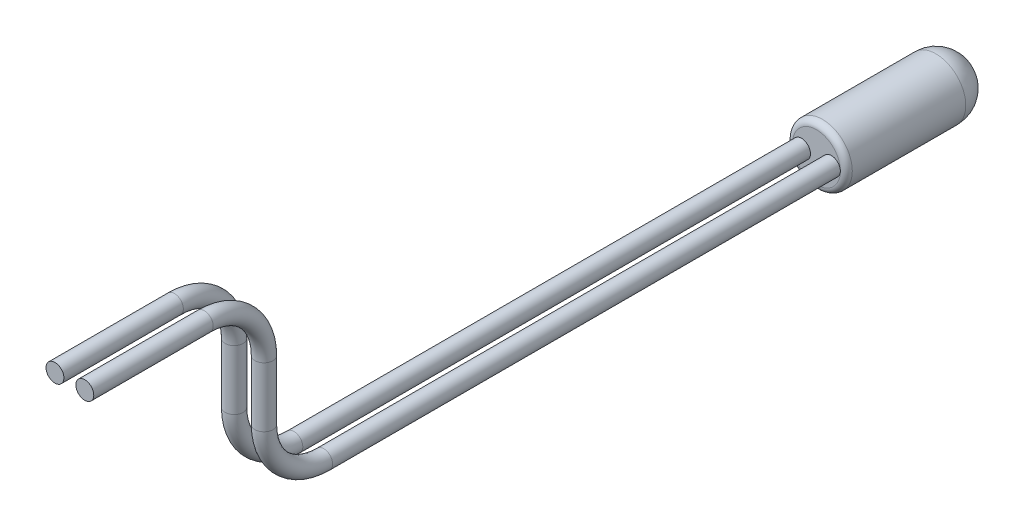
ISO-10303-21;
HEADER;
FILE_DESCRIPTION(('STEP AP214'),'2;1');
FILE_NAME('part.step','',(''),(''),'','','');
FILE_SCHEMA(('AUTOMOTIVE_DESIGN { 1 0 10303 214 1 1 1 1 }'));
ENDSEC;
DATA;
#1=APPLICATION_CONTEXT('core data for automotive mechanical design processes');
#2=APPLICATION_PROTOCOL_DEFINITION('international standard','automotive_design',2000,#1);
#3=PRODUCT_CONTEXT('',#1,'mechanical');
#4=PRODUCT('Part','Part','',(#3));
#5=PRODUCT_RELATED_PRODUCT_CATEGORY('part','',(#4));
#6=PRODUCT_DEFINITION_FORMATION('','',#4);
#7=PRODUCT_DEFINITION_CONTEXT('part definition',#1,'design');
#8=PRODUCT_DEFINITION('design','',#6,#7);
#9=PRODUCT_DEFINITION_SHAPE('','',#8);
#10=(LENGTH_UNIT() NAMED_UNIT(*) SI_UNIT(.MILLI.,.METRE.));
#11=(NAMED_UNIT(*) PLANE_ANGLE_UNIT() SI_UNIT($,.RADIAN.));
#12=(NAMED_UNIT(*) SI_UNIT($,.STERADIAN.) SOLID_ANGLE_UNIT());
#13=UNCERTAINTY_MEASURE_WITH_UNIT(LENGTH_MEASURE(1.E-05),#10,'distance_accuracy_value','');
#14=(GEOMETRIC_REPRESENTATION_CONTEXT(3) GLOBAL_UNCERTAINTY_ASSIGNED_CONTEXT((#13)) GLOBAL_UNIT_ASSIGNED_CONTEXT((#10,
#11,#12)) REPRESENTATION_CONTEXT('',''));
#15=CARTESIAN_POINT('',(0.,0.,0.));
#16=DIRECTION('',(0.,0.,1.));
#17=DIRECTION('',(1.,0.,0.));
#18=AXIS2_PLACEMENT_3D('',#15,#16,#17);
#19=CARTESIAN_POINT('',(0.25,0.,1.25));
#20=DIRECTION('',(0.,0.,1.));
#21=DIRECTION('',(1.,0.,0.));
#22=AXIS2_PLACEMENT_3D('',#19,#20,#21);
#23=PLANE('',#22);
#24=CARTESIAN_POINT('',(0.25,0.,1.25));
#25=DIRECTION('',(0.,0.,1.));
#26=DIRECTION('',(1.,0.,0.));
#27=AXIS2_PLACEMENT_3D('',#24,#25,#26);
#28=CIRCLE('',#27,0.15);
#29=CARTESIAN_POINT('',(0.4,0.,1.25));
#30=VERTEX_POINT('',#29);
#31=EDGE_CURVE('E71',#30,#30,#28,.T.);
#32=ORIENTED_EDGE('',*,*,#31,.F.);
#33=EDGE_LOOP('',(#32));
#34=FACE_BOUND('',#33,.T.);
#35=ADVANCED_FACE('F49',(#34),#23,.F.);
#36=CARTESIAN_POINT('',(0.25,3.,13.75));
#37=DIRECTION('',(0.,0.,1.));
#38=DIRECTION('',(1.,0.,0.));
#39=AXIS2_PLACEMENT_3D('',#36,#37,#38);
#40=PLANE('',#39);
#41=CARTESIAN_POINT('',(0.25,3.,13.75));
#42=DIRECTION('',(0.,0.,1.));
#43=DIRECTION('',(1.,0.,0.));
#44=AXIS2_PLACEMENT_3D('',#41,#42,#43);
#45=CIRCLE('',#44,0.15);
#46=CARTESIAN_POINT('',(0.4,3.,13.75));
#47=VERTEX_POINT('',#46);
#48=EDGE_CURVE('E11',#47,#47,#45,.T.);
#49=ORIENTED_EDGE('',*,*,#48,.T.);
#50=EDGE_LOOP('',(#49));
#51=FACE_BOUND('',#50,.T.);
#52=ADVANCED_FACE('F78',(#51),#40,.T.);
#53=CARTESIAN_POINT('',(0.25,0.,1.25));
#54=DIRECTION('',(0.,0.,1.));
#55=DIRECTION('',(0.,-1.,0.));
#56=AXIS2_PLACEMENT_3D('',#53,#54,#55);
#57=CYLINDRICAL_SURFACE('',#56,0.15);
#58=CARTESIAN_POINT('',(0.25,0.,9.75));
#59=DIRECTION('',(0.,0.,1.));
#60=DIRECTION('',(1.,0.,0.));
#61=AXIS2_PLACEMENT_3D('',#58,#59,#60);
#62=CIRCLE('',#61,0.15);
#63=CARTESIAN_POINT('',(0.25,-0.15,9.75));
#64=VERTEX_POINT('',#63);
#65=EDGE_CURVE('E68',#64,#64,#62,.T.);
#66=ORIENTED_EDGE('',*,*,#65,.F.);
#67=EDGE_LOOP('',(#66));
#68=FACE_BOUND('',#67,.T.);
#69=ORIENTED_EDGE('',*,*,#31,.T.);
#70=EDGE_LOOP('',(#69));
#71=FACE_BOUND('',#70,.T.);
#72=ADVANCED_FACE('F75',(#68,#71),#57,.T.);
#73=CARTESIAN_POINT('',(0.25,0.999999999999999,9.75));
#74=DIRECTION('',(-1.,0.,0.));
#75=DIRECTION('',(0.,0.,1.));
#76=AXIS2_PLACEMENT_3D('',#73,#74,#75);
#77=TOROIDAL_SURFACE('',#76,0.999999999999999,0.15);
#78=CARTESIAN_POINT('',(0.25,0.999999999999999,10.75));
#79=DIRECTION('',(0.,1.,0.));
#80=DIRECTION('',(1.,0.,0.));
#81=AXIS2_PLACEMENT_3D('',#78,#79,#80);
#82=CIRCLE('',#81,0.15);
#83=CARTESIAN_POINT('',(0.25,0.999999999999999,10.9));
#84=VERTEX_POINT('',#83);
#85=EDGE_CURVE('E63',#84,#84,#82,.T.);
#86=CARTESIAN_POINT('',(0.25,0.999999999999999,9.75));
#87=DIRECTION('',(-1.,0.,0.));
#88=DIRECTION('',(0.,0.,1.));
#89=AXIS2_PLACEMENT_3D('',#86,#87,#88);
#90=CIRCLE('',#89,1.15);
#91=EDGE_CURVE('',#64,#84,#90,.T.);
#92=ORIENTED_EDGE('',*,*,#65,.T.);
#93=ORIENTED_EDGE('',*,*,#85,.F.);
#94=ORIENTED_EDGE('',*,*,#91,.T.);
#95=ORIENTED_EDGE('',*,*,#91,.F.);
#96=EDGE_LOOP('',(#92,#94,#93,#95));
#97=FACE_BOUND('',#96,.T.);
#98=ADVANCED_FACE('F96',(#97),#77,.T.);
#99=CARTESIAN_POINT('',(0.25,0.999999999999999,10.75));
#100=DIRECTION('',(0.,1.,0.));
#101=DIRECTION('',(0.,0.,1.));
#102=AXIS2_PLACEMENT_3D('',#99,#100,#101);
#103=CYLINDRICAL_SURFACE('',#102,0.15);
#104=CARTESIAN_POINT('',(0.25,2.,10.75));
#105=DIRECTION('',(0.,1.,0.));
#106=DIRECTION('',(1.,0.,0.));
#107=AXIS2_PLACEMENT_3D('',#104,#105,#106);
#108=CIRCLE('',#107,0.15);
#109=CARTESIAN_POINT('',(0.25,2.,10.6));
#110=VERTEX_POINT('',#109);
#111=EDGE_CURVE('E59',#110,#110,#108,.T.);
#112=ORIENTED_EDGE('',*,*,#111,.F.);
#113=EDGE_LOOP('',(#112));
#114=FACE_BOUND('',#113,.T.);
#115=ORIENTED_EDGE('',*,*,#85,.T.);
#116=EDGE_LOOP('',(#115));
#117=FACE_BOUND('',#116,.T.);
#118=ADVANCED_FACE('F90',(#114,#117),#103,.T.);
#119=CARTESIAN_POINT('',(0.25,2.,11.75));
#120=DIRECTION('',(1.,0.,0.));
#121=DIRECTION('',(0.,0.,-1.));
#122=AXIS2_PLACEMENT_3D('',#119,#120,#121);
#123=TOROIDAL_SURFACE('',#122,0.999999999999999,0.15);
#124=CARTESIAN_POINT('',(0.25,3.,11.75));
#125=DIRECTION('',(0.,0.,1.));
#126=DIRECTION('',(1.,0.,0.));
#127=AXIS2_PLACEMENT_3D('',#124,#125,#126);
#128=CIRCLE('',#127,0.15);
#129=CARTESIAN_POINT('',(0.25,3.15,11.75));
#130=VERTEX_POINT('',#129);
#131=EDGE_CURVE('E55',#130,#130,#128,.T.);
#132=CARTESIAN_POINT('',(0.25,2.,11.75));
#133=DIRECTION('',(1.,0.,0.));
#134=DIRECTION('',(0.,0.,-1.));
#135=AXIS2_PLACEMENT_3D('',#132,#133,#134);
#136=CIRCLE('',#135,1.15);
#137=EDGE_CURVE('',#110,#130,#136,.T.);
#138=ORIENTED_EDGE('',*,*,#111,.T.);
#139=ORIENTED_EDGE('',*,*,#131,.F.);
#140=ORIENTED_EDGE('',*,*,#137,.T.);
#141=ORIENTED_EDGE('',*,*,#137,.F.);
#142=EDGE_LOOP('',(#138,#140,#139,#141));
#143=FACE_BOUND('',#142,.T.);
#144=ADVANCED_FACE('F84',(#143),#123,.T.);
#145=CARTESIAN_POINT('',(0.25,3.,11.75));
#146=DIRECTION('',(0.,0.,1.));
#147=DIRECTION('',(0.,-1.,0.));
#148=AXIS2_PLACEMENT_3D('',#145,#146,#147);
#149=CYLINDRICAL_SURFACE('',#148,0.15);
#150=ORIENTED_EDGE('',*,*,#48,.F.);
#151=EDGE_LOOP('',(#150));
#152=FACE_BOUND('',#151,.T.);
#153=ORIENTED_EDGE('',*,*,#131,.T.);
#154=EDGE_LOOP('',(#153));
#155=FACE_BOUND('',#154,.T.);
#156=ADVANCED_FACE('F82',(#152,#155),#149,.T.);
#157=CLOSED_SHELL('',(#35,#52,#72,#98,#118,#144,#156));
#158=MANIFOLD_SOLID_BREP('B2',#157);
#159=CARTESIAN_POINT('',(-0.25,0.,1.25));
#160=DIRECTION('',(0.,0.,1.));
#161=DIRECTION('',(1.,0.,0.));
#162=AXIS2_PLACEMENT_3D('',#159,#160,#161);
#163=PLANE('',#162);
#164=CARTESIAN_POINT('',(-0.25,0.,1.25));
#165=DIRECTION('',(0.,0.,1.));
#166=DIRECTION('',(1.,0.,0.));
#167=AXIS2_PLACEMENT_3D('',#164,#165,#166);
#168=CIRCLE('',#167,0.15);
#169=CARTESIAN_POINT('',(-0.0999999999999999,0.,1.25));
#170=VERTEX_POINT('',#169);
#171=EDGE_CURVE('E192',#170,#170,#168,.T.);
#172=ORIENTED_EDGE('',*,*,#171,.F.);
#173=EDGE_LOOP('',(#172));
#174=FACE_BOUND('',#173,.T.);
#175=ADVANCED_FACE('F170',(#174),#163,.F.);
#176=CARTESIAN_POINT('',(-0.25,3.,13.75));
#177=DIRECTION('',(0.,0.,1.));
#178=DIRECTION('',(1.,0.,0.));
#179=AXIS2_PLACEMENT_3D('',#176,#177,#178);
#180=PLANE('',#179);
#181=CARTESIAN_POINT('',(-0.25,3.,13.75));
#182=DIRECTION('',(0.,0.,1.));
#183=DIRECTION('',(1.,0.,0.));
#184=AXIS2_PLACEMENT_3D('',#181,#182,#183);
#185=CIRCLE('',#184,0.15);
#186=CARTESIAN_POINT('',(-0.0999999999999999,3.,13.75));
#187=VERTEX_POINT('',#186);
#188=EDGE_CURVE('E48',#187,#187,#185,.T.);
#189=ORIENTED_EDGE('',*,*,#188,.T.);
#190=EDGE_LOOP('',(#189));
#191=FACE_BOUND('',#190,.T.);
#192=ADVANCED_FACE('F199',(#191),#180,.T.);
#193=CARTESIAN_POINT('',(-0.25,0.,1.25));
#194=DIRECTION('',(0.,0.,1.));
#195=DIRECTION('',(0.,-1.,0.));
#196=AXIS2_PLACEMENT_3D('',#193,#194,#195);
#197=CYLINDRICAL_SURFACE('',#196,0.15);
#198=CARTESIAN_POINT('',(-0.25,0.,9.75));
#199=DIRECTION('',(0.,0.,1.));
#200=DIRECTION('',(1.,0.,0.));
#201=AXIS2_PLACEMENT_3D('',#198,#199,#200);
#202=CIRCLE('',#201,0.15);
#203=CARTESIAN_POINT('',(-0.25,-0.15,9.75));
#204=VERTEX_POINT('',#203);
#205=EDGE_CURVE('E189',#204,#204,#202,.T.);
#206=ORIENTED_EDGE('',*,*,#205,.F.);
#207=EDGE_LOOP('',(#206));
#208=FACE_BOUND('',#207,.T.);
#209=ORIENTED_EDGE('',*,*,#171,.T.);
#210=EDGE_LOOP('',(#209));
#211=FACE_BOUND('',#210,.T.);
#212=ADVANCED_FACE('F196',(#208,#211),#197,.T.);
#213=CARTESIAN_POINT('',(-0.25,0.999999999999999,9.75));
#214=DIRECTION('',(-1.,0.,0.));
#215=DIRECTION('',(0.,0.,1.));
#216=AXIS2_PLACEMENT_3D('',#213,#214,#215);
#217=TOROIDAL_SURFACE('',#216,0.999999999999999,0.15);
#218=CARTESIAN_POINT('',(-0.25,0.999999999999999,10.75));
#219=DIRECTION('',(0.,1.,0.));
#220=DIRECTION('',(1.,0.,0.));
#221=AXIS2_PLACEMENT_3D('',#218,#219,#220);
#222=CIRCLE('',#221,0.15);
#223=CARTESIAN_POINT('',(-0.25,0.999999999999999,10.9));
#224=VERTEX_POINT('',#223);
#225=EDGE_CURVE('E184',#224,#224,#222,.T.);
#226=CARTESIAN_POINT('',(-0.25,0.999999999999999,9.75));
#227=DIRECTION('',(-1.,0.,0.));
#228=DIRECTION('',(0.,0.,1.));
#229=AXIS2_PLACEMENT_3D('',#226,#227,#228);
#230=CIRCLE('',#229,1.15);
#231=EDGE_CURVE('',#204,#224,#230,.T.);
#232=ORIENTED_EDGE('',*,*,#205,.T.);
#233=ORIENTED_EDGE('',*,*,#225,.F.);
#234=ORIENTED_EDGE('',*,*,#231,.T.);
#235=ORIENTED_EDGE('',*,*,#231,.F.);
#236=EDGE_LOOP('',(#232,#234,#233,#235));
#237=FACE_BOUND('',#236,.T.);
#238=ADVANCED_FACE('F217',(#237),#217,.T.);
#239=CARTESIAN_POINT('',(-0.25,0.999999999999999,10.75));
#240=DIRECTION('',(0.,1.,0.));
#241=DIRECTION('',(0.,0.,1.));
#242=AXIS2_PLACEMENT_3D('',#239,#240,#241);
#243=CYLINDRICAL_SURFACE('',#242,0.15);
#244=CARTESIAN_POINT('',(-0.25,2.,10.75));
#245=DIRECTION('',(0.,1.,0.));
#246=DIRECTION('',(1.,0.,0.));
#247=AXIS2_PLACEMENT_3D('',#244,#245,#246);
#248=CIRCLE('',#247,0.15);
#249=CARTESIAN_POINT('',(-0.25,2.,10.6));
#250=VERTEX_POINT('',#249);
#251=EDGE_CURVE('E180',#250,#250,#248,.T.);
#252=ORIENTED_EDGE('',*,*,#251,.F.);
#253=EDGE_LOOP('',(#252));
#254=FACE_BOUND('',#253,.T.);
#255=ORIENTED_EDGE('',*,*,#225,.T.);
#256=EDGE_LOOP('',(#255));
#257=FACE_BOUND('',#256,.T.);
#258=ADVANCED_FACE('F211',(#254,#257),#243,.T.);
#259=CARTESIAN_POINT('',(-0.25,2.,11.75));
#260=DIRECTION('',(1.,0.,0.));
#261=DIRECTION('',(0.,0.,-1.));
#262=AXIS2_PLACEMENT_3D('',#259,#260,#261);
#263=TOROIDAL_SURFACE('',#262,0.999999999999999,0.15);
#264=CARTESIAN_POINT('',(-0.25,3.,11.75));
#265=DIRECTION('',(0.,0.,1.));
#266=DIRECTION('',(1.,0.,0.));
#267=AXIS2_PLACEMENT_3D('',#264,#265,#266);
#268=CIRCLE('',#267,0.15);
#269=CARTESIAN_POINT('',(-0.25,3.15,11.75));
#270=VERTEX_POINT('',#269);
#271=EDGE_CURVE('E176',#270,#270,#268,.T.);
#272=CARTESIAN_POINT('',(-0.25,2.,11.75));
#273=DIRECTION('',(1.,0.,0.));
#274=DIRECTION('',(0.,0.,-1.));
#275=AXIS2_PLACEMENT_3D('',#272,#273,#274);
#276=CIRCLE('',#275,1.15);
#277=EDGE_CURVE('',#250,#270,#276,.T.);
#278=ORIENTED_EDGE('',*,*,#251,.T.);
#279=ORIENTED_EDGE('',*,*,#271,.F.);
#280=ORIENTED_EDGE('',*,*,#277,.T.);
#281=ORIENTED_EDGE('',*,*,#277,.F.);
#282=EDGE_LOOP('',(#278,#280,#279,#281));
#283=FACE_BOUND('',#282,.T.);
#284=ADVANCED_FACE('F205',(#283),#263,.T.);
#285=CARTESIAN_POINT('',(-0.25,3.,11.75));
#286=DIRECTION('',(0.,0.,1.));
#287=DIRECTION('',(0.,-1.,0.));
#288=AXIS2_PLACEMENT_3D('',#285,#286,#287);
#289=CYLINDRICAL_SURFACE('',#288,0.15);
#290=ORIENTED_EDGE('',*,*,#188,.F.);
#291=EDGE_LOOP('',(#290));
#292=FACE_BOUND('',#291,.T.);
#293=ORIENTED_EDGE('',*,*,#271,.T.);
#294=EDGE_LOOP('',(#293));
#295=FACE_BOUND('',#294,.T.);
#296=ADVANCED_FACE('F203',(#292,#295),#289,.T.);
#297=CLOSED_SHELL('',(#175,#192,#212,#238,#258,#284,#296));
#298=MANIFOLD_SOLID_BREP('B6',#297);
#299=CARTESIAN_POINT('',(0.,0.,1.25));
#300=DIRECTION('',(0.,0.,1.));
#301=DIRECTION('',(1.,0.,0.));
#302=AXIS2_PLACEMENT_3D('',#299,#300,#301);
#303=PLANE('',#302);
#304=CARTESIAN_POINT('',(0.,0.,1.25));
#305=DIRECTION('',(0.,0.,1.));
#306=DIRECTION('',(1.,0.,0.));
#307=AXIS2_PLACEMENT_3D('',#304,#305,#306);
#308=CIRCLE('',#307,0.4);
#309=CARTESIAN_POINT('',(0.4,0.,1.25));
#310=VERTEX_POINT('',#309);
#311=EDGE_CURVE('E169',#310,#310,#308,.T.);
#312=ORIENTED_EDGE('',*,*,#311,.T.);
#313=EDGE_LOOP('',(#312));
#314=FACE_BOUND('',#313,.T.);
#315=ADVANCED_FACE('F284',(#314),#303,.T.);
#316=CARTESIAN_POINT('',(0.,0.,-0.75));
#317=DIRECTION('',(0.,0.,-1.));
#318=DIRECTION('',(-1.,0.,0.));
#319=AXIS2_PLACEMENT_3D('',#316,#317,#318);
#320=SPHERICAL_SURFACE('',#319,0.5);
#321=CARTESIAN_POINT('',(0.,0.,-0.75));
#322=DIRECTION('',(0.,0.,-1.));
#323=DIRECTION('',(-1.,0.,0.));
#324=AXIS2_PLACEMENT_3D('',#321,#322,#323);
#325=CIRCLE('',#324,0.5);
#326=CARTESIAN_POINT('',(-0.5,0.,-0.75));
#327=VERTEX_POINT('',#326);
#328=EDGE_CURVE('E295',#327,#327,#325,.T.);
#329=ORIENTED_EDGE('',*,*,#328,.T.);
#330=EDGE_LOOP('',(#329));
#331=FACE_BOUND('',#330,.T.);
#332=ADVANCED_FACE('F302',(#331),#320,.T.);
#333=CARTESIAN_POINT('',(0.,0.,-1.25));
#334=DIRECTION('',(0.,0.,-1.));
#335=DIRECTION('',(-1.,0.,0.));
#336=AXIS2_PLACEMENT_3D('',#333,#334,#335);
#337=CYLINDRICAL_SURFACE('',#336,0.5);
#338=CARTESIAN_POINT('',(0.,0.,1.15));
#339=DIRECTION('',(0.,0.,1.));
#340=DIRECTION('',(1.,0.,0.));
#341=AXIS2_PLACEMENT_3D('',#338,#339,#340);
#342=CIRCLE('',#341,0.5);
#343=CARTESIAN_POINT('',(0.5,0.,1.15));
#344=VERTEX_POINT('',#343);
#345=EDGE_CURVE('E291',#344,#344,#342,.F.);
#346=ORIENTED_EDGE('',*,*,#345,.T.);
#347=EDGE_LOOP('',(#346));
#348=FACE_BOUND('',#347,.T.);
#349=ORIENTED_EDGE('',*,*,#328,.F.);
#350=EDGE_LOOP('',(#349));
#351=FACE_BOUND('',#350,.T.);
#352=ADVANCED_FACE('F304',(#348,#351),#337,.T.);
#353=CARTESIAN_POINT('',(0.,0.,1.15));
#354=DIRECTION('',(0.,0.,1.));
#355=DIRECTION('',(1.,0.,0.));
#356=AXIS2_PLACEMENT_3D('',#353,#354,#355);
#357=TOROIDAL_SURFACE('',#356,0.4,0.1);
#358=ORIENTED_EDGE('',*,*,#311,.F.);
#359=EDGE_LOOP('',(#358));
#360=FACE_BOUND('',#359,.T.);
#361=ORIENTED_EDGE('',*,*,#345,.F.);
#362=EDGE_LOOP('',(#361));
#363=FACE_BOUND('',#362,.T.);
#364=ADVANCED_FACE('F286',(#360,#363),#357,.T.);
#365=CLOSED_SHELL('',(#315,#332,#352,#364));
#366=MANIFOLD_SOLID_BREP('B43',#365);
#367=ADVANCED_BREP_SHAPE_REPRESENTATION('',(#18,#158,#298,#366),#14);
#368=SHAPE_DEFINITION_REPRESENTATION(#9,#367);
ENDSEC;
END-ISO-10303-21;
